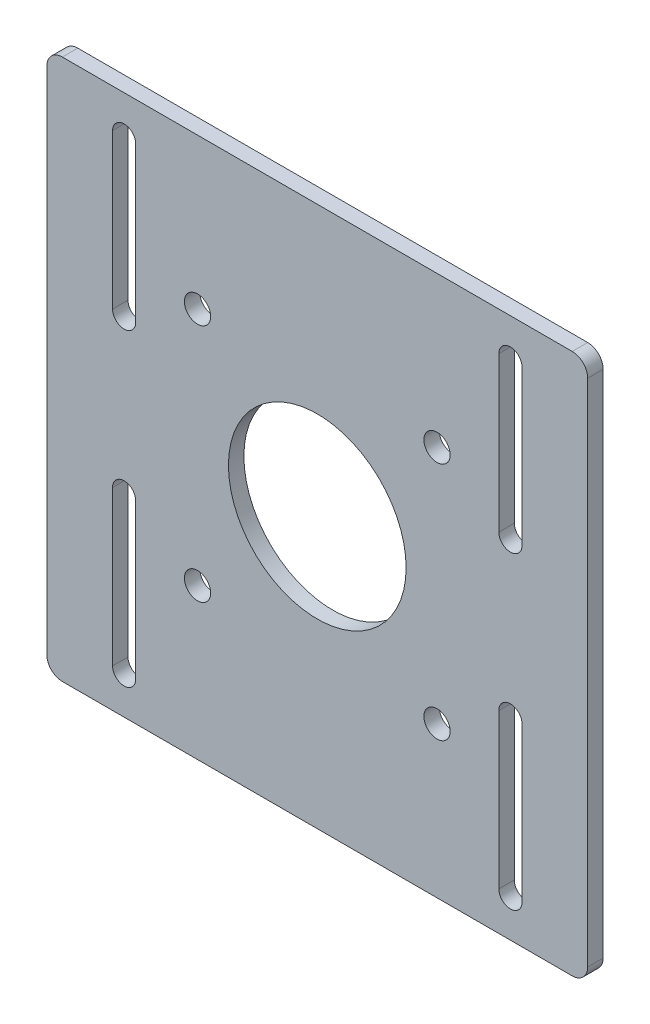
ISO-10303-21;
HEADER;
FILE_DESCRIPTION(('STEP AP214'),'2;1');
FILE_NAME('part.step','',(''),(''),'','','');
FILE_SCHEMA(('AUTOMOTIVE_DESIGN { 1 0 10303 214 1 1 1 1 }'));
ENDSEC;
DATA;
#1=APPLICATION_CONTEXT('core data for automotive mechanical design processes');
#2=APPLICATION_PROTOCOL_DEFINITION('international standard','automotive_design',2000,#1);
#3=PRODUCT_CONTEXT('',#1,'mechanical');
#4=PRODUCT('Part','Part','',(#3));
#5=PRODUCT_RELATED_PRODUCT_CATEGORY('part','',(#4));
#6=PRODUCT_DEFINITION_FORMATION('','',#4);
#7=PRODUCT_DEFINITION_CONTEXT('part definition',#1,'design');
#8=PRODUCT_DEFINITION('design','',#6,#7);
#9=PRODUCT_DEFINITION_SHAPE('','',#8);
#10=(LENGTH_UNIT() NAMED_UNIT(*) SI_UNIT(.MILLI.,.METRE.));
#11=(NAMED_UNIT(*) PLANE_ANGLE_UNIT() SI_UNIT($,.RADIAN.));
#12=(NAMED_UNIT(*) SI_UNIT($,.STERADIAN.) SOLID_ANGLE_UNIT());
#13=UNCERTAINTY_MEASURE_WITH_UNIT(LENGTH_MEASURE(1.E-05),#10,'distance_accuracy_value','');
#14=(GEOMETRIC_REPRESENTATION_CONTEXT(3) GLOBAL_UNCERTAINTY_ASSIGNED_CONTEXT((#13)) GLOBAL_UNIT_ASSIGNED_CONTEXT((#10,
#11,#12)) REPRESENTATION_CONTEXT('',''));
#15=CARTESIAN_POINT('',(0.,0.,0.));
#16=DIRECTION('',(0.,0.,1.));
#17=DIRECTION('',(1.,0.,0.));
#18=AXIS2_PLACEMENT_3D('',#15,#16,#17);
#19=CARTESIAN_POINT('',(0.,0.,2.));
#20=DIRECTION('',(0.,0.,1.));
#21=DIRECTION('',(1.,0.,0.));
#22=AXIS2_PLACEMENT_3D('',#19,#20,#21);
#23=PLANE('',#22);
#24=CARTESIAN_POINT('',(25.,30.,2.));
#25=DIRECTION('',(0.,0.,1.));
#26=DIRECTION('',(1.,0.,0.));
#27=AXIS2_PLACEMENT_3D('',#24,#25,#26);
#28=CIRCLE('',#27,1.5);
#29=CARTESIAN_POINT('',(26.5,30.,2.));
#30=VERTEX_POINT('',#29);
#31=CARTESIAN_POINT('',(23.5,30.,2.));
#32=VERTEX_POINT('',#31);
#33=EDGE_CURVE('E48',#30,#32,#28,.T.);
#34=ORIENTED_EDGE('',*,*,#33,.F.);
#35=DIRECTION('',(0.,-1.,0.));
#36=VECTOR('',#35,1.);
#37=CARTESIAN_POINT('',(26.5,30.,2.));
#38=LINE('',#37,#36);
#39=CARTESIAN_POINT('',(26.5,10.,2.));
#40=VERTEX_POINT('',#39);
#41=EDGE_CURVE('E244',#30,#40,#38,.T.);
#42=ORIENTED_EDGE('',*,*,#41,.T.);
#43=CARTESIAN_POINT('',(25.,10.,2.));
#44=DIRECTION('',(0.,0.,-1.));
#45=DIRECTION('',(-1.,0.,0.));
#46=AXIS2_PLACEMENT_3D('',#43,#44,#45);
#47=CIRCLE('',#46,1.5);
#48=CARTESIAN_POINT('',(23.5,10.,2.));
#49=VERTEX_POINT('',#48);
#50=EDGE_CURVE('E247',#40,#49,#47,.T.);
#51=ORIENTED_EDGE('',*,*,#50,.T.);
#52=DIRECTION('',(0.,-1.,0.));
#53=VECTOR('',#52,1.);
#54=CARTESIAN_POINT('',(23.5,30.,2.));
#55=LINE('',#54,#53);
#56=EDGE_CURVE('E251',#32,#49,#55,.T.);
#57=ORIENTED_EDGE('',*,*,#56,.F.);
#58=EDGE_LOOP('',(#34,#42,#51,#57));
#59=FACE_BOUND('',#58,.T.);
#60=CARTESIAN_POINT('',(-25.,-10.,2.));
#61=DIRECTION('',(0.,0.,1.));
#62=DIRECTION('',(1.,0.,0.));
#63=AXIS2_PLACEMENT_3D('',#60,#61,#62);
#64=CIRCLE('',#63,1.5);
#65=CARTESIAN_POINT('',(-23.5,-10.,2.));
#66=VERTEX_POINT('',#65);
#67=CARTESIAN_POINT('',(-26.5,-9.99999999999999,2.));
#68=VERTEX_POINT('',#67);
#69=EDGE_CURVE('E56',#66,#68,#64,.T.);
#70=ORIENTED_EDGE('',*,*,#69,.F.);
#71=DIRECTION('',(0.,-1.,0.));
#72=VECTOR('',#71,1.);
#73=CARTESIAN_POINT('',(-23.5,-10.,2.));
#74=LINE('',#73,#72);
#75=CARTESIAN_POINT('',(-23.5,-30.,2.));
#76=VERTEX_POINT('',#75);
#77=EDGE_CURVE('E271',#66,#76,#74,.T.);
#78=ORIENTED_EDGE('',*,*,#77,.T.);
#79=CARTESIAN_POINT('',(-25.,-30.,2.));
#80=DIRECTION('',(0.,0.,-1.));
#81=DIRECTION('',(-1.,0.,0.));
#82=AXIS2_PLACEMENT_3D('',#79,#80,#81);
#83=CIRCLE('',#82,1.5);
#84=CARTESIAN_POINT('',(-26.5,-30.,2.));
#85=VERTEX_POINT('',#84);
#86=EDGE_CURVE('E274',#76,#85,#83,.T.);
#87=ORIENTED_EDGE('',*,*,#86,.T.);
#88=DIRECTION('',(0.,-1.,0.));
#89=VECTOR('',#88,1.);
#90=CARTESIAN_POINT('',(-26.5,-9.99999999999999,2.));
#91=LINE('',#90,#89);
#92=EDGE_CURVE('E278',#68,#85,#91,.T.);
#93=ORIENTED_EDGE('',*,*,#92,.F.);
#94=EDGE_LOOP('',(#70,#78,#87,#93));
#95=FACE_BOUND('',#94,.T.);
#96=CARTESIAN_POINT('',(25.,-10.,2.));
#97=DIRECTION('',(0.,0.,1.));
#98=DIRECTION('',(1.,0.,0.));
#99=AXIS2_PLACEMENT_3D('',#96,#97,#98);
#100=CIRCLE('',#99,1.49999999999999);
#101=CARTESIAN_POINT('',(26.5,-10.,2.));
#102=VERTEX_POINT('',#101);
#103=CARTESIAN_POINT('',(23.5,-10.,2.));
#104=VERTEX_POINT('',#103);
#105=EDGE_CURVE('E197',#102,#104,#100,.T.);
#106=ORIENTED_EDGE('',*,*,#105,.F.);
#107=DIRECTION('',(0.,-1.,0.));
#108=VECTOR('',#107,1.);
#109=CARTESIAN_POINT('',(26.5,-10.,2.));
#110=LINE('',#109,#108);
#111=CARTESIAN_POINT('',(26.5,-30.,2.));
#112=VERTEX_POINT('',#111);
#113=EDGE_CURVE('E206',#102,#112,#110,.T.);
#114=ORIENTED_EDGE('',*,*,#113,.T.);
#115=CARTESIAN_POINT('',(25.,-30.,2.));
#116=DIRECTION('',(0.,0.,-1.));
#117=DIRECTION('',(-1.,0.,0.));
#118=AXIS2_PLACEMENT_3D('',#115,#116,#117);
#119=CIRCLE('',#118,1.49999999999999);
#120=CARTESIAN_POINT('',(23.5,-30.,2.));
#121=VERTEX_POINT('',#120);
#122=EDGE_CURVE('E212',#112,#121,#119,.T.);
#123=ORIENTED_EDGE('',*,*,#122,.T.);
#124=DIRECTION('',(0.,-1.,0.));
#125=VECTOR('',#124,1.);
#126=CARTESIAN_POINT('',(23.5,-10.,2.));
#127=LINE('',#126,#125);
#128=EDGE_CURVE('E217',#104,#121,#127,.T.);
#129=ORIENTED_EDGE('',*,*,#128,.F.);
#130=EDGE_LOOP('',(#106,#114,#123,#129));
#131=FACE_BOUND('',#130,.T.);
#132=CARTESIAN_POINT('',(-15.5,15.5,2.));
#133=DIRECTION('',(0.,0.,1.));
#134=DIRECTION('',(1.,0.,0.));
#135=AXIS2_PLACEMENT_3D('',#132,#133,#134);
#136=CIRCLE('',#135,1.7);
#137=CARTESIAN_POINT('',(-13.8,15.5,2.));
#138=VERTEX_POINT('',#137);
#139=EDGE_CURVE('E322',#138,#138,#136,.T.);
#140=ORIENTED_EDGE('',*,*,#139,.F.);
#141=EDGE_LOOP('',(#140));
#142=FACE_BOUND('',#141,.T.);
#143=CARTESIAN_POINT('',(15.5,15.5,2.));
#144=DIRECTION('',(0.,0.,1.));
#145=DIRECTION('',(1.,0.,0.));
#146=AXIS2_PLACEMENT_3D('',#143,#144,#145);
#147=CIRCLE('',#146,1.7);
#148=CARTESIAN_POINT('',(17.2,15.5,2.));
#149=VERTEX_POINT('',#148);
#150=EDGE_CURVE('E328',#149,#149,#147,.T.);
#151=ORIENTED_EDGE('',*,*,#150,.F.);
#152=EDGE_LOOP('',(#151));
#153=FACE_BOUND('',#152,.T.);
#154=CARTESIAN_POINT('',(15.5,-15.5,2.));
#155=DIRECTION('',(0.,0.,1.));
#156=DIRECTION('',(1.,0.,0.));
#157=AXIS2_PLACEMENT_3D('',#154,#155,#156);
#158=CIRCLE('',#157,1.7);
#159=CARTESIAN_POINT('',(17.2,-15.5,2.));
#160=VERTEX_POINT('',#159);
#161=EDGE_CURVE('E334',#160,#160,#158,.T.);
#162=ORIENTED_EDGE('',*,*,#161,.F.);
#163=EDGE_LOOP('',(#162));
#164=FACE_BOUND('',#163,.T.);
#165=CARTESIAN_POINT('',(-15.5,-15.5,2.));
#166=DIRECTION('',(0.,0.,1.));
#167=DIRECTION('',(1.,0.,0.));
#168=AXIS2_PLACEMENT_3D('',#165,#166,#167);
#169=CIRCLE('',#168,1.7);
#170=CARTESIAN_POINT('',(-13.8,-15.5,2.));
#171=VERTEX_POINT('',#170);
#172=EDGE_CURVE('E340',#171,#171,#169,.T.);
#173=ORIENTED_EDGE('',*,*,#172,.F.);
#174=EDGE_LOOP('',(#173));
#175=FACE_BOUND('',#174,.T.);
#176=CARTESIAN_POINT('',(0.,0.,2.));
#177=DIRECTION('',(0.,0.,1.));
#178=DIRECTION('',(1.,0.,0.));
#179=AXIS2_PLACEMENT_3D('',#176,#177,#178);
#180=CIRCLE('',#179,11.5);
#181=CARTESIAN_POINT('',(11.5,0.,2.));
#182=VERTEX_POINT('',#181);
#183=EDGE_CURVE('E346',#182,#182,#180,.T.);
#184=ORIENTED_EDGE('',*,*,#183,.F.);
#185=EDGE_LOOP('',(#184));
#186=FACE_BOUND('',#185,.T.);
#187=DIRECTION('',(-1.,0.,0.));
#188=VECTOR('',#187,1.);
#189=CARTESIAN_POINT('',(-35.,35.,2.));
#190=LINE('',#189,#188);
#191=CARTESIAN_POINT('',(33.,35.,2.));
#192=VERTEX_POINT('',#191);
#193=CARTESIAN_POINT('',(-33.,35.,2.));
#194=VERTEX_POINT('',#193);
#195=EDGE_CURVE('E363',#192,#194,#190,.T.);
#196=ORIENTED_EDGE('',*,*,#195,.T.);
#197=CARTESIAN_POINT('',(-33.,33.,2.));
#198=DIRECTION('',(0.,0.,1.));
#199=DIRECTION('',(1.,0.,0.));
#200=AXIS2_PLACEMENT_3D('',#197,#198,#199);
#201=CIRCLE('',#200,2.);
#202=CARTESIAN_POINT('',(-35.,33.,2.));
#203=VERTEX_POINT('',#202);
#204=EDGE_CURVE('E400',#194,#203,#201,.T.);
#205=ORIENTED_EDGE('',*,*,#204,.T.);
#206=DIRECTION('',(0.,-1.,0.));
#207=VECTOR('',#206,1.);
#208=CARTESIAN_POINT('',(-35.,35.,2.));
#209=LINE('',#208,#207);
#210=CARTESIAN_POINT('',(-35.,-33.,2.));
#211=VERTEX_POINT('',#210);
#212=EDGE_CURVE('E353',#203,#211,#209,.T.);
#213=ORIENTED_EDGE('',*,*,#212,.T.);
#214=CARTESIAN_POINT('',(-33.,-33.,2.));
#215=DIRECTION('',(0.,0.,1.));
#216=DIRECTION('',(1.,0.,0.));
#217=AXIS2_PLACEMENT_3D('',#214,#215,#216);
#218=CIRCLE('',#217,2.);
#219=CARTESIAN_POINT('',(-33.,-35.,2.));
#220=VERTEX_POINT('',#219);
#221=EDGE_CURVE('E398',#211,#220,#218,.T.);
#222=ORIENTED_EDGE('',*,*,#221,.T.);
#223=DIRECTION('',(1.,0.,0.));
#224=VECTOR('',#223,1.);
#225=CARTESIAN_POINT('',(-35.,-35.,2.));
#226=LINE('',#225,#224);
#227=CARTESIAN_POINT('',(33.,-35.,2.));
#228=VERTEX_POINT('',#227);
#229=EDGE_CURVE('E356',#220,#228,#226,.T.);
#230=ORIENTED_EDGE('',*,*,#229,.T.);
#231=CARTESIAN_POINT('',(33.,-33.,2.));
#232=DIRECTION('',(0.,0.,1.));
#233=DIRECTION('',(1.,0.,0.));
#234=AXIS2_PLACEMENT_3D('',#231,#232,#233);
#235=CIRCLE('',#234,2.);
#236=CARTESIAN_POINT('',(35.,-33.,2.));
#237=VERTEX_POINT('',#236);
#238=EDGE_CURVE('E396',#228,#237,#235,.T.);
#239=ORIENTED_EDGE('',*,*,#238,.T.);
#240=DIRECTION('',(0.,1.,0.));
#241=VECTOR('',#240,1.);
#242=CARTESIAN_POINT('',(35.,35.,2.));
#243=LINE('',#242,#241);
#244=CARTESIAN_POINT('',(35.,33.,2.));
#245=VERTEX_POINT('',#244);
#246=EDGE_CURVE('E360',#237,#245,#243,.T.);
#247=ORIENTED_EDGE('',*,*,#246,.T.);
#248=CARTESIAN_POINT('',(33.,33.,2.));
#249=DIRECTION('',(0.,0.,1.));
#250=DIRECTION('',(1.,0.,0.));
#251=AXIS2_PLACEMENT_3D('',#248,#249,#250);
#252=CIRCLE('',#251,2.);
#253=EDGE_CURVE('E394',#245,#192,#252,.T.);
#254=ORIENTED_EDGE('',*,*,#253,.T.);
#255=EDGE_LOOP('',(#196,#205,#213,#222,#230,#239,#247,#254));
#256=FACE_BOUND('',#255,.T.);
#257=CARTESIAN_POINT('',(-25.,30.,2.));
#258=DIRECTION('',(0.,0.,1.));
#259=DIRECTION('',(1.,0.,0.));
#260=AXIS2_PLACEMENT_3D('',#257,#258,#259);
#261=CIRCLE('',#260,1.5);
#262=CARTESIAN_POINT('',(-23.5,30.,2.));
#263=VERTEX_POINT('',#262);
#264=CARTESIAN_POINT('',(-26.5,30.,2.));
#265=VERTEX_POINT('',#264);
#266=EDGE_CURVE('E294',#263,#265,#261,.T.);
#267=ORIENTED_EDGE('',*,*,#266,.F.);
#268=DIRECTION('',(0.,-1.,0.));
#269=VECTOR('',#268,1.);
#270=CARTESIAN_POINT('',(-23.5,30.,2.));
#271=LINE('',#270,#269);
#272=CARTESIAN_POINT('',(-23.5,10.,2.));
#273=VERTEX_POINT('',#272);
#274=EDGE_CURVE('E255',#263,#273,#271,.T.);
#275=ORIENTED_EDGE('',*,*,#274,.T.);
#276=CARTESIAN_POINT('',(-25.,10.,2.));
#277=DIRECTION('',(0.,0.,-1.));
#278=DIRECTION('',(-1.,0.,0.));
#279=AXIS2_PLACEMENT_3D('',#276,#277,#278);
#280=CIRCLE('',#279,1.5);
#281=CARTESIAN_POINT('',(-26.5,10.,2.));
#282=VERTEX_POINT('',#281);
#283=EDGE_CURVE('E305',#273,#282,#280,.T.);
#284=ORIENTED_EDGE('',*,*,#283,.T.);
#285=DIRECTION('',(0.,-1.,0.));
#286=VECTOR('',#285,1.);
#287=CARTESIAN_POINT('',(-26.5,30.,2.));
#288=LINE('',#287,#286);
#289=EDGE_CURVE('E308',#265,#282,#288,.T.);
#290=ORIENTED_EDGE('',*,*,#289,.F.);
#291=EDGE_LOOP('',(#267,#275,#284,#290));
#292=FACE_BOUND('',#291,.T.);
#293=ADVANCED_FACE('F33',(#59,#95,#131,#142,#153,#164,#175,#186,#256,#292),#23,.T.);
#294=CARTESIAN_POINT('',(0.,0.,0.));
#295=DIRECTION('',(0.,0.,1.));
#296=DIRECTION('',(1.,0.,0.));
#297=AXIS2_PLACEMENT_3D('',#294,#295,#296);
#298=PLANE('',#297);
#299=DIRECTION('',(0.,-1.,0.));
#300=VECTOR('',#299,1.);
#301=CARTESIAN_POINT('',(26.5,30.,0.));
#302=LINE('',#301,#300);
#303=CARTESIAN_POINT('',(26.5,30.,0.));
#304=VERTEX_POINT('',#303);
#305=CARTESIAN_POINT('',(26.5,10.,0.));
#306=VERTEX_POINT('',#305);
#307=EDGE_CURVE('E237',#304,#306,#302,.T.);
#308=ORIENTED_EDGE('',*,*,#307,.F.);
#309=CARTESIAN_POINT('',(25.,30.,0.));
#310=DIRECTION('',(0.,0.,1.));
#311=DIRECTION('',(1.,0.,0.));
#312=AXIS2_PLACEMENT_3D('',#309,#310,#311);
#313=CIRCLE('',#312,1.5);
#314=CARTESIAN_POINT('',(23.5,30.,0.));
#315=VERTEX_POINT('',#314);
#316=EDGE_CURVE('E248',#304,#315,#313,.T.);
#317=ORIENTED_EDGE('',*,*,#316,.T.);
#318=DIRECTION('',(0.,-1.,0.));
#319=VECTOR('',#318,1.);
#320=CARTESIAN_POINT('',(23.5,30.,0.));
#321=LINE('',#320,#319);
#322=CARTESIAN_POINT('',(23.5,10.,0.));
#323=VERTEX_POINT('',#322);
#324=EDGE_CURVE('E260',#315,#323,#321,.T.);
#325=ORIENTED_EDGE('',*,*,#324,.T.);
#326=CARTESIAN_POINT('',(25.,10.,0.));
#327=DIRECTION('',(0.,0.,-1.));
#328=DIRECTION('',(-1.,0.,0.));
#329=AXIS2_PLACEMENT_3D('',#326,#327,#328);
#330=CIRCLE('',#329,1.5);
#331=EDGE_CURVE('E257',#306,#323,#330,.T.);
#332=ORIENTED_EDGE('',*,*,#331,.F.);
#333=EDGE_LOOP('',(#308,#317,#325,#332));
#334=FACE_BOUND('',#333,.T.);
#335=DIRECTION('',(0.,-1.,0.));
#336=VECTOR('',#335,1.);
#337=CARTESIAN_POINT('',(-23.5,-10.,0.));
#338=LINE('',#337,#336);
#339=CARTESIAN_POINT('',(-23.5,-10.,0.));
#340=VERTEX_POINT('',#339);
#341=CARTESIAN_POINT('',(-23.5,-30.,0.));
#342=VERTEX_POINT('',#341);
#343=EDGE_CURVE('E267',#340,#342,#338,.T.);
#344=ORIENTED_EDGE('',*,*,#343,.F.);
#345=CARTESIAN_POINT('',(-25.,-10.,0.));
#346=DIRECTION('',(0.,0.,1.));
#347=DIRECTION('',(1.,0.,0.));
#348=AXIS2_PLACEMENT_3D('',#345,#346,#347);
#349=CIRCLE('',#348,1.5);
#350=CARTESIAN_POINT('',(-26.5,-9.99999999999999,0.));
#351=VERTEX_POINT('',#350);
#352=EDGE_CURVE('E275',#340,#351,#349,.T.);
#353=ORIENTED_EDGE('',*,*,#352,.T.);
#354=DIRECTION('',(0.,-1.,0.));
#355=VECTOR('',#354,1.);
#356=CARTESIAN_POINT('',(-26.5,-9.99999999999999,0.));
#357=LINE('',#356,#355);
#358=CARTESIAN_POINT('',(-26.5,-30.,0.));
#359=VERTEX_POINT('',#358);
#360=EDGE_CURVE('E286',#351,#359,#357,.T.);
#361=ORIENTED_EDGE('',*,*,#360,.T.);
#362=CARTESIAN_POINT('',(-25.,-30.,0.));
#363=DIRECTION('',(0.,0.,-1.));
#364=DIRECTION('',(-1.,0.,0.));
#365=AXIS2_PLACEMENT_3D('',#362,#363,#364);
#366=CIRCLE('',#365,1.5);
#367=EDGE_CURVE('E283',#342,#359,#366,.T.);
#368=ORIENTED_EDGE('',*,*,#367,.F.);
#369=EDGE_LOOP('',(#344,#353,#361,#368));
#370=FACE_BOUND('',#369,.T.);
#371=DIRECTION('',(0.,-1.,0.));
#372=VECTOR('',#371,1.);
#373=CARTESIAN_POINT('',(26.5,-10.,0.));
#374=LINE('',#373,#372);
#375=CARTESIAN_POINT('',(26.5,-10.,0.));
#376=VERTEX_POINT('',#375);
#377=CARTESIAN_POINT('',(26.5,-30.,0.));
#378=VERTEX_POINT('',#377);
#379=EDGE_CURVE('E225',#376,#378,#374,.T.);
#380=ORIENTED_EDGE('',*,*,#379,.F.);
#381=CARTESIAN_POINT('',(25.,-10.,0.));
#382=DIRECTION('',(0.,0.,1.));
#383=DIRECTION('',(1.,0.,0.));
#384=AXIS2_PLACEMENT_3D('',#381,#382,#383);
#385=CIRCLE('',#384,1.49999999999999);
#386=CARTESIAN_POINT('',(23.5,-10.,0.));
#387=VERTEX_POINT('',#386);
#388=EDGE_CURVE('E200',#376,#387,#385,.T.);
#389=ORIENTED_EDGE('',*,*,#388,.T.);
#390=DIRECTION('',(0.,-1.,0.));
#391=VECTOR('',#390,1.);
#392=CARTESIAN_POINT('',(23.5,-10.,0.));
#393=LINE('',#392,#391);
#394=CARTESIAN_POINT('',(23.5,-30.,0.));
#395=VERTEX_POINT('',#394);
#396=EDGE_CURVE('E231',#387,#395,#393,.T.);
#397=ORIENTED_EDGE('',*,*,#396,.T.);
#398=CARTESIAN_POINT('',(25.,-30.,0.));
#399=DIRECTION('',(0.,0.,-1.));
#400=DIRECTION('',(-1.,0.,0.));
#401=AXIS2_PLACEMENT_3D('',#398,#399,#400);
#402=CIRCLE('',#401,1.49999999999999);
#403=EDGE_CURVE('E227',#378,#395,#402,.T.);
#404=ORIENTED_EDGE('',*,*,#403,.F.);
#405=EDGE_LOOP('',(#380,#389,#397,#404));
#406=FACE_BOUND('',#405,.T.);
#407=DIRECTION('',(0.,-1.,0.));
#408=VECTOR('',#407,1.);
#409=CARTESIAN_POINT('',(-35.,35.,0.));
#410=LINE('',#409,#408);
#411=CARTESIAN_POINT('',(-35.,33.,0.));
#412=VERTEX_POINT('',#411);
#413=CARTESIAN_POINT('',(-35.,-33.,0.));
#414=VERTEX_POINT('',#413);
#415=EDGE_CURVE('E352',#412,#414,#410,.T.);
#416=ORIENTED_EDGE('',*,*,#415,.F.);
#417=CARTESIAN_POINT('',(-33.,33.,0.));
#418=DIRECTION('',(0.,0.,1.));
#419=DIRECTION('',(1.,0.,0.));
#420=AXIS2_PLACEMENT_3D('',#417,#418,#419);
#421=CIRCLE('',#420,2.);
#422=CARTESIAN_POINT('',(-33.,35.,0.));
#423=VERTEX_POINT('',#422);
#424=EDGE_CURVE('E387',#412,#423,#421,.F.);
#425=ORIENTED_EDGE('',*,*,#424,.T.);
#426=DIRECTION('',(-1.,0.,0.));
#427=VECTOR('',#426,1.);
#428=CARTESIAN_POINT('',(-35.,35.,0.));
#429=LINE('',#428,#427);
#430=CARTESIAN_POINT('',(33.,35.,0.));
#431=VERTEX_POINT('',#430);
#432=EDGE_CURVE('E357',#431,#423,#429,.T.);
#433=ORIENTED_EDGE('',*,*,#432,.F.);
#434=CARTESIAN_POINT('',(33.,33.,0.));
#435=DIRECTION('',(0.,0.,1.));
#436=DIRECTION('',(1.,0.,0.));
#437=AXIS2_PLACEMENT_3D('',#434,#435,#436);
#438=CIRCLE('',#437,2.);
#439=CARTESIAN_POINT('',(35.,33.,0.));
#440=VERTEX_POINT('',#439);
#441=EDGE_CURVE('E381',#431,#440,#438,.F.);
#442=ORIENTED_EDGE('',*,*,#441,.T.);
#443=DIRECTION('',(0.,1.,0.));
#444=VECTOR('',#443,1.);
#445=CARTESIAN_POINT('',(35.,35.,0.));
#446=LINE('',#445,#444);
#447=CARTESIAN_POINT('',(35.,-33.,0.));
#448=VERTEX_POINT('',#447);
#449=EDGE_CURVE('E372',#448,#440,#446,.T.);
#450=ORIENTED_EDGE('',*,*,#449,.F.);
#451=CARTESIAN_POINT('',(33.,-33.,0.));
#452=DIRECTION('',(0.,0.,1.));
#453=DIRECTION('',(1.,0.,0.));
#454=AXIS2_PLACEMENT_3D('',#451,#452,#453);
#455=CIRCLE('',#454,2.);
#456=CARTESIAN_POINT('',(33.,-35.,0.));
#457=VERTEX_POINT('',#456);
#458=EDGE_CURVE('E383',#448,#457,#455,.F.);
#459=ORIENTED_EDGE('',*,*,#458,.T.);
#460=DIRECTION('',(1.,0.,0.));
#461=VECTOR('',#460,1.);
#462=CARTESIAN_POINT('',(-35.,-35.,0.));
#463=LINE('',#462,#461);
#464=CARTESIAN_POINT('',(-33.,-35.,0.));
#465=VERTEX_POINT('',#464);
#466=EDGE_CURVE('E369',#465,#457,#463,.T.);
#467=ORIENTED_EDGE('',*,*,#466,.F.);
#468=CARTESIAN_POINT('',(-33.,-33.,0.));
#469=DIRECTION('',(0.,0.,1.));
#470=DIRECTION('',(1.,0.,0.));
#471=AXIS2_PLACEMENT_3D('',#468,#469,#470);
#472=CIRCLE('',#471,2.);
#473=EDGE_CURVE('E385',#465,#414,#472,.F.);
#474=ORIENTED_EDGE('',*,*,#473,.T.);
#475=EDGE_LOOP('',(#416,#425,#433,#442,#450,#459,#467,#474));
#476=FACE_BOUND('',#475,.T.);
#477=CARTESIAN_POINT('',(0.,0.,0.));
#478=DIRECTION('',(0.,0.,1.));
#479=DIRECTION('',(1.,0.,0.));
#480=AXIS2_PLACEMENT_3D('',#477,#478,#479);
#481=CIRCLE('',#480,11.5);
#482=CARTESIAN_POINT('',(11.5,0.,0.));
#483=VERTEX_POINT('',#482);
#484=EDGE_CURVE('E349',#483,#483,#481,.T.);
#485=ORIENTED_EDGE('',*,*,#484,.T.);
#486=EDGE_LOOP('',(#485));
#487=FACE_BOUND('',#486,.T.);
#488=CARTESIAN_POINT('',(-15.5,-15.5,0.));
#489=DIRECTION('',(0.,0.,1.));
#490=DIRECTION('',(1.,0.,0.));
#491=AXIS2_PLACEMENT_3D('',#488,#489,#490);
#492=CIRCLE('',#491,1.7);
#493=CARTESIAN_POINT('',(-13.8,-15.5,0.));
#494=VERTEX_POINT('',#493);
#495=EDGE_CURVE('E343',#494,#494,#492,.T.);
#496=ORIENTED_EDGE('',*,*,#495,.T.);
#497=EDGE_LOOP('',(#496));
#498=FACE_BOUND('',#497,.T.);
#499=CARTESIAN_POINT('',(15.5,-15.5,0.));
#500=DIRECTION('',(0.,0.,1.));
#501=DIRECTION('',(1.,0.,0.));
#502=AXIS2_PLACEMENT_3D('',#499,#500,#501);
#503=CIRCLE('',#502,1.7);
#504=CARTESIAN_POINT('',(17.2,-15.5,0.));
#505=VERTEX_POINT('',#504);
#506=EDGE_CURVE('E337',#505,#505,#503,.T.);
#507=ORIENTED_EDGE('',*,*,#506,.T.);
#508=EDGE_LOOP('',(#507));
#509=FACE_BOUND('',#508,.T.);
#510=CARTESIAN_POINT('',(15.5,15.5,0.));
#511=DIRECTION('',(0.,0.,1.));
#512=DIRECTION('',(1.,0.,0.));
#513=AXIS2_PLACEMENT_3D('',#510,#511,#512);
#514=CIRCLE('',#513,1.7);
#515=CARTESIAN_POINT('',(17.2,15.5,0.));
#516=VERTEX_POINT('',#515);
#517=EDGE_CURVE('E331',#516,#516,#514,.T.);
#518=ORIENTED_EDGE('',*,*,#517,.T.);
#519=EDGE_LOOP('',(#518));
#520=FACE_BOUND('',#519,.T.);
#521=CARTESIAN_POINT('',(-15.5,15.5,0.));
#522=DIRECTION('',(0.,0.,1.));
#523=DIRECTION('',(1.,0.,0.));
#524=AXIS2_PLACEMENT_3D('',#521,#522,#523);
#525=CIRCLE('',#524,1.7);
#526=CARTESIAN_POINT('',(-13.8,15.5,0.));
#527=VERTEX_POINT('',#526);
#528=EDGE_CURVE('E325',#527,#527,#525,.T.);
#529=ORIENTED_EDGE('',*,*,#528,.T.);
#530=EDGE_LOOP('',(#529));
#531=FACE_BOUND('',#530,.T.);
#532=DIRECTION('',(0.,-1.,0.));
#533=VECTOR('',#532,1.);
#534=CARTESIAN_POINT('',(-23.5,30.,0.));
#535=LINE('',#534,#533);
#536=CARTESIAN_POINT('',(-23.5,30.,0.));
#537=VERTEX_POINT('',#536);
#538=CARTESIAN_POINT('',(-23.5,10.,0.));
#539=VERTEX_POINT('',#538);
#540=EDGE_CURVE('E291',#537,#539,#535,.T.);
#541=ORIENTED_EDGE('',*,*,#540,.F.);
#542=CARTESIAN_POINT('',(-25.,30.,0.));
#543=DIRECTION('',(0.,0.,1.));
#544=DIRECTION('',(1.,0.,0.));
#545=AXIS2_PLACEMENT_3D('',#542,#543,#544);
#546=CIRCLE('',#545,1.5);
#547=CARTESIAN_POINT('',(-26.5,30.,0.));
#548=VERTEX_POINT('',#547);
#549=EDGE_CURVE('E299',#537,#548,#546,.T.);
#550=ORIENTED_EDGE('',*,*,#549,.T.);
#551=DIRECTION('',(0.,-1.,0.));
#552=VECTOR('',#551,1.);
#553=CARTESIAN_POINT('',(-26.5,30.,0.));
#554=LINE('',#553,#552);
#555=CARTESIAN_POINT('',(-26.5,10.,0.));
#556=VERTEX_POINT('',#555);
#557=EDGE_CURVE('E296',#548,#556,#554,.T.);
#558=ORIENTED_EDGE('',*,*,#557,.T.);
#559=CARTESIAN_POINT('',(-25.,10.,0.));
#560=DIRECTION('',(0.,0.,-1.));
#561=DIRECTION('',(-1.,0.,0.));
#562=AXIS2_PLACEMENT_3D('',#559,#560,#561);
#563=CIRCLE('',#562,1.5);
#564=EDGE_CURVE('E293',#539,#556,#563,.T.);
#565=ORIENTED_EDGE('',*,*,#564,.F.);
#566=EDGE_LOOP('',(#541,#550,#558,#565));
#567=FACE_BOUND('',#566,.T.);
#568=ADVANCED_FACE('F425',(#334,#370,#406,#476,#487,#498,#509,#520,#531,#567),#298,.F.);
#569=CARTESIAN_POINT('',(-35.,35.,2.));
#570=DIRECTION('',(1.,0.,0.));
#571=DIRECTION('',(0.,0.,-1.));
#572=AXIS2_PLACEMENT_3D('',#569,#570,#571);
#573=PLANE('',#572);
#574=ORIENTED_EDGE('',*,*,#212,.F.);
#575=DIRECTION('',(0.,0.,-1.));
#576=VECTOR('',#575,1.);
#577=CARTESIAN_POINT('',(-35.,33.,2.));
#578=LINE('',#577,#576);
#579=EDGE_CURVE('E378',#203,#412,#578,.T.);
#580=ORIENTED_EDGE('',*,*,#579,.T.);
#581=ORIENTED_EDGE('',*,*,#415,.T.);
#582=DIRECTION('',(0.,0.,-1.));
#583=VECTOR('',#582,1.);
#584=CARTESIAN_POINT('',(-35.,-33.,2.));
#585=LINE('',#584,#583);
#586=EDGE_CURVE('E366',#414,#211,#585,.F.);
#587=ORIENTED_EDGE('',*,*,#586,.T.);
#588=EDGE_LOOP('',(#574,#580,#581,#587));
#589=FACE_BOUND('',#588,.T.);
#590=ADVANCED_FACE('F433',(#589),#573,.F.);
#591=CARTESIAN_POINT('',(-35.,-35.,2.));
#592=DIRECTION('',(0.,1.,0.));
#593=DIRECTION('',(-1.,0.,0.));
#594=AXIS2_PLACEMENT_3D('',#591,#592,#593);
#595=PLANE('',#594);
#596=ORIENTED_EDGE('',*,*,#229,.F.);
#597=DIRECTION('',(0.,0.,-1.));
#598=VECTOR('',#597,1.);
#599=CARTESIAN_POINT('',(-33.,-35.,2.));
#600=LINE('',#599,#598);
#601=EDGE_CURVE('E404',#220,#465,#600,.T.);
#602=ORIENTED_EDGE('',*,*,#601,.T.);
#603=ORIENTED_EDGE('',*,*,#466,.T.);
#604=DIRECTION('',(0.,0.,-1.));
#605=VECTOR('',#604,1.);
#606=CARTESIAN_POINT('',(33.,-35.,2.));
#607=LINE('',#606,#605);
#608=EDGE_CURVE('E402',#457,#228,#607,.F.);
#609=ORIENTED_EDGE('',*,*,#608,.T.);
#610=EDGE_LOOP('',(#596,#602,#603,#609));
#611=FACE_BOUND('',#610,.T.);
#612=ADVANCED_FACE('F442',(#611),#595,.F.);
#613=CARTESIAN_POINT('',(35.,35.,2.));
#614=DIRECTION('',(-1.,0.,0.));
#615=DIRECTION('',(0.,-1.,0.));
#616=AXIS2_PLACEMENT_3D('',#613,#614,#615);
#617=PLANE('',#616);
#618=ORIENTED_EDGE('',*,*,#246,.F.);
#619=DIRECTION('',(0.,0.,-1.));
#620=VECTOR('',#619,1.);
#621=CARTESIAN_POINT('',(35.,-33.,2.));
#622=LINE('',#621,#620);
#623=EDGE_CURVE('E11',#237,#448,#622,.T.);
#624=ORIENTED_EDGE('',*,*,#623,.T.);
#625=ORIENTED_EDGE('',*,*,#449,.T.);
#626=DIRECTION('',(0.,0.,-1.));
#627=VECTOR('',#626,1.);
#628=CARTESIAN_POINT('',(35.,33.,2.));
#629=LINE('',#628,#627);
#630=EDGE_CURVE('E41',#440,#245,#629,.F.);
#631=ORIENTED_EDGE('',*,*,#630,.T.);
#632=EDGE_LOOP('',(#618,#624,#625,#631));
#633=FACE_BOUND('',#632,.T.);
#634=ADVANCED_FACE('F409',(#633),#617,.F.);
#635=CARTESIAN_POINT('',(-35.,35.,2.));
#636=DIRECTION('',(0.,-1.,0.));
#637=DIRECTION('',(0.,0.,-1.));
#638=AXIS2_PLACEMENT_3D('',#635,#636,#637);
#639=PLANE('',#638);
#640=ORIENTED_EDGE('',*,*,#432,.T.);
#641=DIRECTION('',(0.,0.,-1.));
#642=VECTOR('',#641,1.);
#643=CARTESIAN_POINT('',(-33.,35.,2.));
#644=LINE('',#643,#642);
#645=EDGE_CURVE('E392',#423,#194,#644,.F.);
#646=ORIENTED_EDGE('',*,*,#645,.T.);
#647=ORIENTED_EDGE('',*,*,#195,.F.);
#648=DIRECTION('',(0.,0.,-1.));
#649=VECTOR('',#648,1.);
#650=CARTESIAN_POINT('',(33.,35.,2.));
#651=LINE('',#650,#649);
#652=EDGE_CURVE('E389',#192,#431,#651,.T.);
#653=ORIENTED_EDGE('',*,*,#652,.T.);
#654=EDGE_LOOP('',(#640,#646,#647,#653));
#655=FACE_BOUND('',#654,.T.);
#656=ADVANCED_FACE('F421',(#655),#639,.F.);
#657=CARTESIAN_POINT('',(-33.,33.,2.));
#658=DIRECTION('',(0.,0.,-1.));
#659=DIRECTION('',(-1.,0.,0.));
#660=AXIS2_PLACEMENT_3D('',#657,#658,#659);
#661=CYLINDRICAL_SURFACE('',#660,2.);
#662=ORIENTED_EDGE('',*,*,#204,.F.);
#663=ORIENTED_EDGE('',*,*,#645,.F.);
#664=ORIENTED_EDGE('',*,*,#424,.F.);
#665=ORIENTED_EDGE('',*,*,#579,.F.);
#666=EDGE_LOOP('',(#662,#663,#664,#665));
#667=FACE_BOUND('',#666,.T.);
#668=ADVANCED_FACE('F430',(#667),#661,.T.);
#669=CARTESIAN_POINT('',(-33.,-33.,2.));
#670=DIRECTION('',(0.,0.,-1.));
#671=DIRECTION('',(-1.,0.,0.));
#672=AXIS2_PLACEMENT_3D('',#669,#670,#671);
#673=CYLINDRICAL_SURFACE('',#672,2.);
#674=ORIENTED_EDGE('',*,*,#221,.F.);
#675=ORIENTED_EDGE('',*,*,#586,.F.);
#676=ORIENTED_EDGE('',*,*,#473,.F.);
#677=ORIENTED_EDGE('',*,*,#601,.F.);
#678=EDGE_LOOP('',(#674,#675,#676,#677));
#679=FACE_BOUND('',#678,.T.);
#680=ADVANCED_FACE('F439',(#679),#673,.T.);
#681=CARTESIAN_POINT('',(33.,-33.,2.));
#682=DIRECTION('',(0.,0.,-1.));
#683=DIRECTION('',(-1.,0.,0.));
#684=AXIS2_PLACEMENT_3D('',#681,#682,#683);
#685=CYLINDRICAL_SURFACE('',#684,2.);
#686=ORIENTED_EDGE('',*,*,#238,.F.);
#687=ORIENTED_EDGE('',*,*,#608,.F.);
#688=ORIENTED_EDGE('',*,*,#458,.F.);
#689=ORIENTED_EDGE('',*,*,#623,.F.);
#690=EDGE_LOOP('',(#686,#687,#688,#689));
#691=FACE_BOUND('',#690,.T.);
#692=ADVANCED_FACE('F445',(#691),#685,.T.);
#693=CARTESIAN_POINT('',(33.,33.,2.));
#694=DIRECTION('',(0.,0.,-1.));
#695=DIRECTION('',(-1.,0.,0.));
#696=AXIS2_PLACEMENT_3D('',#693,#694,#695);
#697=CYLINDRICAL_SURFACE('',#696,2.);
#698=ORIENTED_EDGE('',*,*,#253,.F.);
#699=ORIENTED_EDGE('',*,*,#630,.F.);
#700=ORIENTED_EDGE('',*,*,#441,.F.);
#701=ORIENTED_EDGE('',*,*,#652,.F.);
#702=EDGE_LOOP('',(#698,#699,#700,#701));
#703=FACE_BOUND('',#702,.T.);
#704=ADVANCED_FACE('F35',(#703),#697,.T.);
#705=CARTESIAN_POINT('',(0.,0.,2.));
#706=DIRECTION('',(0.,0.,1.));
#707=DIRECTION('',(1.,0.,0.));
#708=AXIS2_PLACEMENT_3D('',#705,#706,#707);
#709=CYLINDRICAL_SURFACE('',#708,11.5);
#710=ORIENTED_EDGE('',*,*,#484,.F.);
#711=EDGE_LOOP('',(#710));
#712=FACE_BOUND('',#711,.T.);
#713=ORIENTED_EDGE('',*,*,#183,.T.);
#714=EDGE_LOOP('',(#713));
#715=FACE_BOUND('',#714,.T.);
#716=ADVANCED_FACE('F451',(#712,#715),#709,.F.);
#717=CARTESIAN_POINT('',(-15.5,-15.5,2.));
#718=DIRECTION('',(0.,0.,1.));
#719=DIRECTION('',(1.,0.,0.));
#720=AXIS2_PLACEMENT_3D('',#717,#718,#719);
#721=CYLINDRICAL_SURFACE('',#720,1.7);
#722=ORIENTED_EDGE('',*,*,#495,.F.);
#723=EDGE_LOOP('',(#722));
#724=FACE_BOUND('',#723,.T.);
#725=ORIENTED_EDGE('',*,*,#172,.T.);
#726=EDGE_LOOP('',(#725));
#727=FACE_BOUND('',#726,.T.);
#728=ADVANCED_FACE('F501',(#724,#727),#721,.F.);
#729=CARTESIAN_POINT('',(15.5,-15.5,2.));
#730=DIRECTION('',(0.,0.,1.));
#731=DIRECTION('',(1.,0.,0.));
#732=AXIS2_PLACEMENT_3D('',#729,#730,#731);
#733=CYLINDRICAL_SURFACE('',#732,1.7);
#734=ORIENTED_EDGE('',*,*,#506,.F.);
#735=EDGE_LOOP('',(#734));
#736=FACE_BOUND('',#735,.T.);
#737=ORIENTED_EDGE('',*,*,#161,.T.);
#738=EDGE_LOOP('',(#737));
#739=FACE_BOUND('',#738,.T.);
#740=ADVANCED_FACE('F510',(#736,#739),#733,.F.);
#741=CARTESIAN_POINT('',(15.5,15.5,2.));
#742=DIRECTION('',(0.,0.,1.));
#743=DIRECTION('',(1.,0.,0.));
#744=AXIS2_PLACEMENT_3D('',#741,#742,#743);
#745=CYLINDRICAL_SURFACE('',#744,1.7);
#746=ORIENTED_EDGE('',*,*,#517,.F.);
#747=EDGE_LOOP('',(#746));
#748=FACE_BOUND('',#747,.T.);
#749=ORIENTED_EDGE('',*,*,#150,.T.);
#750=EDGE_LOOP('',(#749));
#751=FACE_BOUND('',#750,.T.);
#752=ADVANCED_FACE('F519',(#748,#751),#745,.F.);
#753=CARTESIAN_POINT('',(-15.5,15.5,2.));
#754=DIRECTION('',(0.,0.,1.));
#755=DIRECTION('',(1.,0.,0.));
#756=AXIS2_PLACEMENT_3D('',#753,#754,#755);
#757=CYLINDRICAL_SURFACE('',#756,1.7);
#758=ORIENTED_EDGE('',*,*,#528,.F.);
#759=EDGE_LOOP('',(#758));
#760=FACE_BOUND('',#759,.T.);
#761=ORIENTED_EDGE('',*,*,#139,.T.);
#762=EDGE_LOOP('',(#761));
#763=FACE_BOUND('',#762,.T.);
#764=ADVANCED_FACE('F529',(#760,#763),#757,.F.);
#765=CARTESIAN_POINT('',(-23.5,30.,0.));
#766=DIRECTION('',(-1.,0.,0.));
#767=DIRECTION('',(0.,0.,1.));
#768=AXIS2_PLACEMENT_3D('',#765,#766,#767);
#769=PLANE('',#768);
#770=ORIENTED_EDGE('',*,*,#274,.F.);
#771=DIRECTION('',(0.,0.,1.));
#772=VECTOR('',#771,1.);
#773=CARTESIAN_POINT('',(-23.5,30.,0.));
#774=LINE('',#773,#772);
#775=EDGE_CURVE('E302',#537,#263,#774,.T.);
#776=ORIENTED_EDGE('',*,*,#775,.F.);
#777=ORIENTED_EDGE('',*,*,#540,.T.);
#778=DIRECTION('',(0.,0.,1.));
#779=VECTOR('',#778,1.);
#780=CARTESIAN_POINT('',(-23.5,10.,0.));
#781=LINE('',#780,#779);
#782=EDGE_CURVE('E319',#539,#273,#781,.T.);
#783=ORIENTED_EDGE('',*,*,#782,.T.);
#784=EDGE_LOOP('',(#770,#776,#777,#783));
#785=FACE_BOUND('',#784,.T.);
#786=ADVANCED_FACE('F538',(#785),#769,.T.);
#787=CARTESIAN_POINT('',(-25.,10.,0.));
#788=DIRECTION('',(0.,0.,1.));
#789=DIRECTION('',(1.,0.,0.));
#790=AXIS2_PLACEMENT_3D('',#787,#788,#789);
#791=CYLINDRICAL_SURFACE('',#790,1.5);
#792=ORIENTED_EDGE('',*,*,#283,.F.);
#793=ORIENTED_EDGE('',*,*,#782,.F.);
#794=ORIENTED_EDGE('',*,*,#564,.T.);
#795=DIRECTION('',(0.,0.,1.));
#796=VECTOR('',#795,1.);
#797=CARTESIAN_POINT('',(-26.5,10.,0.));
#798=LINE('',#797,#796);
#799=EDGE_CURVE('E317',#556,#282,#798,.T.);
#800=ORIENTED_EDGE('',*,*,#799,.T.);
#801=EDGE_LOOP('',(#792,#793,#794,#800));
#802=FACE_BOUND('',#801,.T.);
#803=ADVANCED_FACE('F559',(#802),#791,.F.);
#804=CARTESIAN_POINT('',(-26.5,30.,0.));
#805=DIRECTION('',(-1.,0.,0.));
#806=DIRECTION('',(0.,-1.,0.));
#807=AXIS2_PLACEMENT_3D('',#804,#805,#806);
#808=PLANE('',#807);
#809=ORIENTED_EDGE('',*,*,#289,.T.);
#810=ORIENTED_EDGE('',*,*,#799,.F.);
#811=ORIENTED_EDGE('',*,*,#557,.F.);
#812=DIRECTION('',(0.,0.,1.));
#813=VECTOR('',#812,1.);
#814=CARTESIAN_POINT('',(-26.5,30.,0.));
#815=LINE('',#814,#813);
#816=EDGE_CURVE('E315',#548,#265,#815,.T.);
#817=ORIENTED_EDGE('',*,*,#816,.T.);
#818=EDGE_LOOP('',(#809,#810,#811,#817));
#819=FACE_BOUND('',#818,.T.);
#820=ADVANCED_FACE('F569',(#819),#808,.F.);
#821=CARTESIAN_POINT('',(-25.,30.,0.));
#822=DIRECTION('',(0.,0.,1.));
#823=DIRECTION('',(1.,0.,0.));
#824=AXIS2_PLACEMENT_3D('',#821,#822,#823);
#825=CYLINDRICAL_SURFACE('',#824,1.5);
#826=ORIENTED_EDGE('',*,*,#266,.T.);
#827=ORIENTED_EDGE('',*,*,#816,.F.);
#828=ORIENTED_EDGE('',*,*,#549,.F.);
#829=ORIENTED_EDGE('',*,*,#775,.T.);
#830=EDGE_LOOP('',(#826,#827,#828,#829));
#831=FACE_BOUND('',#830,.T.);
#832=ADVANCED_FACE('F579',(#831),#825,.F.);
#833=CARTESIAN_POINT('',(25.,-10.,0.));
#834=DIRECTION('',(0.,0.,1.));
#835=DIRECTION('',(1.,0.,0.));
#836=AXIS2_PLACEMENT_3D('',#833,#834,#835);
#837=CYLINDRICAL_SURFACE('',#836,1.49999999999999);
#838=ORIENTED_EDGE('',*,*,#105,.T.);
#839=DIRECTION('',(0.,0.,1.));
#840=VECTOR('',#839,1.);
#841=CARTESIAN_POINT('',(23.5,-10.,0.));
#842=LINE('',#841,#840);
#843=EDGE_CURVE('E228',#387,#104,#842,.T.);
#844=ORIENTED_EDGE('',*,*,#843,.F.);
#845=ORIENTED_EDGE('',*,*,#388,.F.);
#846=DIRECTION('',(0.,0.,1.));
#847=VECTOR('',#846,1.);
#848=CARTESIAN_POINT('',(26.5,-10.,0.));
#849=LINE('',#848,#847);
#850=EDGE_CURVE('E193',#376,#102,#849,.T.);
#851=ORIENTED_EDGE('',*,*,#850,.T.);
#852=EDGE_LOOP('',(#838,#844,#845,#851));
#853=FACE_BOUND('',#852,.T.);
#854=ADVANCED_FACE('F195',(#853),#837,.F.);
#855=CARTESIAN_POINT('',(26.5,-10.,0.));
#856=DIRECTION('',(-1.,0.,0.));
#857=DIRECTION('',(0.,-1.,0.));
#858=AXIS2_PLACEMENT_3D('',#855,#856,#857);
#859=PLANE('',#858);
#860=ORIENTED_EDGE('',*,*,#113,.F.);
#861=ORIENTED_EDGE('',*,*,#850,.F.);
#862=ORIENTED_EDGE('',*,*,#379,.T.);
#863=DIRECTION('',(0.,0.,1.));
#864=VECTOR('',#863,1.);
#865=CARTESIAN_POINT('',(26.5,-30.,0.));
#866=LINE('',#865,#864);
#867=EDGE_CURVE('E203',#378,#112,#866,.T.);
#868=ORIENTED_EDGE('',*,*,#867,.T.);
#869=EDGE_LOOP('',(#860,#861,#862,#868));
#870=FACE_BOUND('',#869,.T.);
#871=ADVANCED_FACE('F207',(#870),#859,.T.);
#872=CARTESIAN_POINT('',(25.,-30.,0.));
#873=DIRECTION('',(0.,0.,1.));
#874=DIRECTION('',(1.,0.,0.));
#875=AXIS2_PLACEMENT_3D('',#872,#873,#874);
#876=CYLINDRICAL_SURFACE('',#875,1.49999999999999);
#877=ORIENTED_EDGE('',*,*,#122,.F.);
#878=ORIENTED_EDGE('',*,*,#867,.F.);
#879=ORIENTED_EDGE('',*,*,#403,.T.);
#880=DIRECTION('',(0.,0.,1.));
#881=VECTOR('',#880,1.);
#882=CARTESIAN_POINT('',(23.5,-30.,0.));
#883=LINE('',#882,#881);
#884=EDGE_CURVE('E720',#395,#121,#883,.T.);
#885=ORIENTED_EDGE('',*,*,#884,.T.);
#886=EDGE_LOOP('',(#877,#878,#879,#885));
#887=FACE_BOUND('',#886,.T.);
#888=ADVANCED_FACE('F606',(#887),#876,.F.);
#889=CARTESIAN_POINT('',(23.5,-10.,0.));
#890=DIRECTION('',(-1.,0.,0.));
#891=DIRECTION('',(0.,-1.,0.));
#892=AXIS2_PLACEMENT_3D('',#889,#890,#891);
#893=PLANE('',#892);
#894=ORIENTED_EDGE('',*,*,#128,.T.);
#895=ORIENTED_EDGE('',*,*,#884,.F.);
#896=ORIENTED_EDGE('',*,*,#396,.F.);
#897=ORIENTED_EDGE('',*,*,#843,.T.);
#898=EDGE_LOOP('',(#894,#895,#896,#897));
#899=FACE_BOUND('',#898,.T.);
#900=ADVANCED_FACE('F615',(#899),#893,.F.);
#901=CARTESIAN_POINT('',(-25.,-10.,0.));
#902=DIRECTION('',(0.,0.,1.));
#903=DIRECTION('',(1.,0.,0.));
#904=AXIS2_PLACEMENT_3D('',#901,#902,#903);
#905=CYLINDRICAL_SURFACE('',#904,1.5);
#906=ORIENTED_EDGE('',*,*,#69,.T.);
#907=DIRECTION('',(0.,0.,1.));
#908=VECTOR('',#907,1.);
#909=CARTESIAN_POINT('',(-26.5,-9.99999999999999,0.));
#910=LINE('',#909,#908);
#911=EDGE_CURVE('E265',#351,#68,#910,.T.);
#912=ORIENTED_EDGE('',*,*,#911,.F.);
#913=ORIENTED_EDGE('',*,*,#352,.F.);
#914=DIRECTION('',(0.,0.,1.));
#915=VECTOR('',#914,1.);
#916=CARTESIAN_POINT('',(-23.5,-10.,0.));
#917=LINE('',#916,#915);
#918=EDGE_CURVE('E218',#340,#66,#917,.T.);
#919=ORIENTED_EDGE('',*,*,#918,.T.);
#920=EDGE_LOOP('',(#906,#912,#913,#919));
#921=FACE_BOUND('',#920,.T.);
#922=ADVANCED_FACE('F625',(#921),#905,.F.);
#923=CARTESIAN_POINT('',(-23.5,-10.,0.));
#924=DIRECTION('',(-1.,0.,0.));
#925=DIRECTION('',(0.,-1.,0.));
#926=AXIS2_PLACEMENT_3D('',#923,#924,#925);
#927=PLANE('',#926);
#928=ORIENTED_EDGE('',*,*,#77,.F.);
#929=ORIENTED_EDGE('',*,*,#918,.F.);
#930=ORIENTED_EDGE('',*,*,#343,.T.);
#931=DIRECTION('',(0.,0.,1.));
#932=VECTOR('',#931,1.);
#933=CARTESIAN_POINT('',(-23.5,-30.,0.));
#934=LINE('',#933,#932);
#935=EDGE_CURVE('E220',#342,#76,#934,.T.);
#936=ORIENTED_EDGE('',*,*,#935,.T.);
#937=EDGE_LOOP('',(#928,#929,#930,#936));
#938=FACE_BOUND('',#937,.T.);
#939=ADVANCED_FACE('F635',(#938),#927,.T.);
#940=CARTESIAN_POINT('',(-25.,-30.,0.));
#941=DIRECTION('',(0.,0.,1.));
#942=DIRECTION('',(1.,0.,0.));
#943=AXIS2_PLACEMENT_3D('',#940,#941,#942);
#944=CYLINDRICAL_SURFACE('',#943,1.5);
#945=ORIENTED_EDGE('',*,*,#86,.F.);
#946=ORIENTED_EDGE('',*,*,#935,.F.);
#947=ORIENTED_EDGE('',*,*,#367,.T.);
#948=DIRECTION('',(0.,0.,1.));
#949=VECTOR('',#948,1.);
#950=CARTESIAN_POINT('',(-26.5,-30.,0.));
#951=LINE('',#950,#949);
#952=EDGE_CURVE('E268',#359,#85,#951,.T.);
#953=ORIENTED_EDGE('',*,*,#952,.T.);
#954=EDGE_LOOP('',(#945,#946,#947,#953));
#955=FACE_BOUND('',#954,.T.);
#956=ADVANCED_FACE('F644',(#955),#944,.F.);
#957=CARTESIAN_POINT('',(-26.5,-9.99999999999999,0.));
#958=DIRECTION('',(-1.,0.,0.));
#959=DIRECTION('',(0.,0.,1.));
#960=AXIS2_PLACEMENT_3D('',#957,#958,#959);
#961=PLANE('',#960);
#962=ORIENTED_EDGE('',*,*,#92,.T.);
#963=ORIENTED_EDGE('',*,*,#952,.F.);
#964=ORIENTED_EDGE('',*,*,#360,.F.);
#965=ORIENTED_EDGE('',*,*,#911,.T.);
#966=EDGE_LOOP('',(#962,#963,#964,#965));
#967=FACE_BOUND('',#966,.T.);
#968=ADVANCED_FACE('F654',(#967),#961,.F.);
#969=CARTESIAN_POINT('',(25.,30.,0.));
#970=DIRECTION('',(0.,0.,1.));
#971=DIRECTION('',(1.,0.,0.));
#972=AXIS2_PLACEMENT_3D('',#969,#970,#971);
#973=CYLINDRICAL_SURFACE('',#972,1.5);
#974=ORIENTED_EDGE('',*,*,#33,.T.);
#975=DIRECTION('',(0.,0.,1.));
#976=VECTOR('',#975,1.);
#977=CARTESIAN_POINT('',(23.5,30.,0.));
#978=LINE('',#977,#976);
#979=EDGE_CURVE('E235',#315,#32,#978,.T.);
#980=ORIENTED_EDGE('',*,*,#979,.F.);
#981=ORIENTED_EDGE('',*,*,#316,.F.);
#982=DIRECTION('',(0.,0.,1.));
#983=VECTOR('',#982,1.);
#984=CARTESIAN_POINT('',(26.5,30.,0.));
#985=LINE('',#984,#983);
#986=EDGE_CURVE('E242',#304,#30,#985,.T.);
#987=ORIENTED_EDGE('',*,*,#986,.T.);
#988=EDGE_LOOP('',(#974,#980,#981,#987));
#989=FACE_BOUND('',#988,.T.);
#990=ADVANCED_FACE('F664',(#989),#973,.F.);
#991=CARTESIAN_POINT('',(26.5,30.,0.));
#992=DIRECTION('',(-1.,0.,0.));
#993=DIRECTION('',(0.,-1.,0.));
#994=AXIS2_PLACEMENT_3D('',#991,#992,#993);
#995=PLANE('',#994);
#996=ORIENTED_EDGE('',*,*,#41,.F.);
#997=ORIENTED_EDGE('',*,*,#986,.F.);
#998=ORIENTED_EDGE('',*,*,#307,.T.);
#999=DIRECTION('',(0.,0.,1.));
#1000=VECTOR('',#999,1.);
#1001=CARTESIAN_POINT('',(26.5,10.,0.));
#1002=LINE('',#1001,#1000);
#1003=EDGE_CURVE('E240',#306,#40,#1002,.T.);
#1004=ORIENTED_EDGE('',*,*,#1003,.T.);
#1005=EDGE_LOOP('',(#996,#997,#998,#1004));
#1006=FACE_BOUND('',#1005,.T.);
#1007=ADVANCED_FACE('F674',(#1006),#995,.T.);
#1008=CARTESIAN_POINT('',(25.,10.,0.));
#1009=DIRECTION('',(0.,0.,1.));
#1010=DIRECTION('',(1.,0.,0.));
#1011=AXIS2_PLACEMENT_3D('',#1008,#1009,#1010);
#1012=CYLINDRICAL_SURFACE('',#1011,1.5);
#1013=ORIENTED_EDGE('',*,*,#50,.F.);
#1014=ORIENTED_EDGE('',*,*,#1003,.F.);
#1015=ORIENTED_EDGE('',*,*,#331,.T.);
#1016=DIRECTION('',(0.,0.,1.));
#1017=VECTOR('',#1016,1.);
#1018=CARTESIAN_POINT('',(23.5,10.,0.));
#1019=LINE('',#1018,#1017);
#1020=EDGE_CURVE('E238',#323,#49,#1019,.T.);
#1021=ORIENTED_EDGE('',*,*,#1020,.T.);
#1022=EDGE_LOOP('',(#1013,#1014,#1015,#1021));
#1023=FACE_BOUND('',#1022,.T.);
#1024=ADVANCED_FACE('F683',(#1023),#1012,.F.);
#1025=CARTESIAN_POINT('',(23.5,30.,0.));
#1026=DIRECTION('',(-1.,0.,0.));
#1027=DIRECTION('',(0.,0.,1.));
#1028=AXIS2_PLACEMENT_3D('',#1025,#1026,#1027);
#1029=PLANE('',#1028);
#1030=ORIENTED_EDGE('',*,*,#56,.T.);
#1031=ORIENTED_EDGE('',*,*,#1020,.F.);
#1032=ORIENTED_EDGE('',*,*,#324,.F.);
#1033=ORIENTED_EDGE('',*,*,#979,.T.);
#1034=EDGE_LOOP('',(#1030,#1031,#1032,#1033));
#1035=FACE_BOUND('',#1034,.T.);
#1036=ADVANCED_FACE('F693',(#1035),#1029,.F.);
#1037=CLOSED_SHELL('',(#293,#568,#590,#612,#634,#656,#668,#680,#692,#704,#716,#728,#740,#752,
#764,#786,#803,#820,#832,#854,#871,#888,#900,#922,#939,#956,#968,#990,#1007,#1024,#1036));
#1038=MANIFOLD_SOLID_BREP('B2',#1037);
#1039=ADVANCED_BREP_SHAPE_REPRESENTATION('',(#18,#1038),#14);
#1040=SHAPE_DEFINITION_REPRESENTATION(#9,#1039);
ENDSEC;
END-ISO-10303-21;
